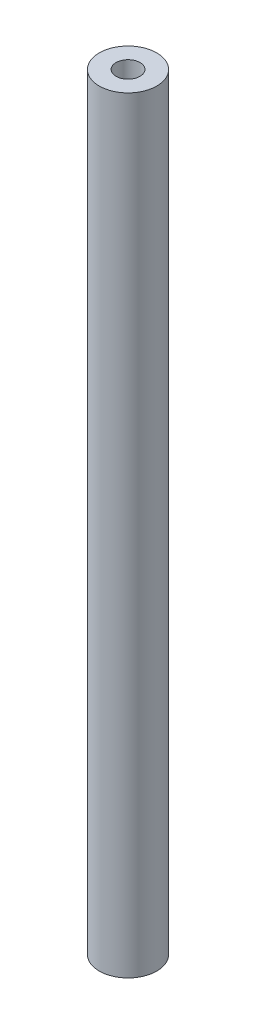
ISO-10303-21;
HEADER;
FILE_DESCRIPTION(('STEP AP214'),'2;1');
FILE_NAME('part.step','',(''),(''),'','','');
FILE_SCHEMA(('AUTOMOTIVE_DESIGN { 1 0 10303 214 1 1 1 1 }'));
ENDSEC;
DATA;
#1=APPLICATION_CONTEXT('core data for automotive mechanical design processes');
#2=APPLICATION_PROTOCOL_DEFINITION('international standard','automotive_design',2000,#1);
#3=PRODUCT_CONTEXT('',#1,'mechanical');
#4=PRODUCT('Part','Part','',(#3));
#5=PRODUCT_RELATED_PRODUCT_CATEGORY('part','',(#4));
#6=PRODUCT_DEFINITION_FORMATION('','',#4);
#7=PRODUCT_DEFINITION_CONTEXT('part definition',#1,'design');
#8=PRODUCT_DEFINITION('design','',#6,#7);
#9=PRODUCT_DEFINITION_SHAPE('','',#8);
#10=(LENGTH_UNIT() NAMED_UNIT(*) SI_UNIT(.MILLI.,.METRE.));
#11=(NAMED_UNIT(*) PLANE_ANGLE_UNIT() SI_UNIT($,.RADIAN.));
#12=(NAMED_UNIT(*) SI_UNIT($,.STERADIAN.) SOLID_ANGLE_UNIT());
#13=UNCERTAINTY_MEASURE_WITH_UNIT(LENGTH_MEASURE(1.E-05),#10,'distance_accuracy_value','');
#14=(GEOMETRIC_REPRESENTATION_CONTEXT(3) GLOBAL_UNCERTAINTY_ASSIGNED_CONTEXT((#13)) GLOBAL_UNIT_ASSIGNED_CONTEXT((#10,
#11,#12)) REPRESENTATION_CONTEXT('',''));
#15=CARTESIAN_POINT('',(0.,0.,0.));
#16=DIRECTION('',(0.,0.,1.));
#17=DIRECTION('',(1.,0.,0.));
#18=AXIS2_PLACEMENT_3D('',#15,#16,#17);
#19=CARTESIAN_POINT('',(0.,1219.2,0.));
#20=DIRECTION('',(0.,-1.,0.));
#21=DIRECTION('',(0.,0.,-1.));
#22=AXIS2_PLACEMENT_3D('',#19,#20,#21);
#23=CYLINDRICAL_SURFACE('',#22,45.72);
#24=CARTESIAN_POINT('',(0.,1219.2,0.));
#25=DIRECTION('',(0.,1.,0.));
#26=DIRECTION('',(0.,0.,1.));
#27=AXIS2_PLACEMENT_3D('',#24,#25,#26);
#28=CIRCLE('',#27,45.72);
#29=CARTESIAN_POINT('',(0.,1219.2,-45.72));
#30=VERTEX_POINT('',#29);
#31=EDGE_CURVE('E10',#30,#30,#28,.T.);
#32=CARTESIAN_POINT('',(0.,0.,0.));
#33=DIRECTION('',(0.,1.,0.));
#34=DIRECTION('',(0.,0.,1.));
#35=AXIS2_PLACEMENT_3D('',#32,#33,#34);
#36=CIRCLE('',#35,45.72);
#37=CARTESIAN_POINT('',(0.,0.,-45.72));
#38=VERTEX_POINT('',#37);
#39=EDGE_CURVE('E38',#38,#38,#36,.T.);
#40=CARTESIAN_POINT('',(0.,1219.2,-45.72));
#41=CARTESIAN_POINT('',(0.,1206.5,-45.72));
#42=CARTESIAN_POINT('',(0.,1193.8,-45.72));
#43=CARTESIAN_POINT('',(0.,1168.4,-45.72));
#44=CARTESIAN_POINT('',(0.,1155.7,-45.72));
#45=CARTESIAN_POINT('',(0.,1130.3,-45.72));
#46=CARTESIAN_POINT('',(0.,1117.6,-45.72));
#47=CARTESIAN_POINT('',(0.,1092.2,-45.72));
#48=CARTESIAN_POINT('',(0.,1079.5,-45.72));
#49=CARTESIAN_POINT('',(0.,1054.1,-45.72));
#50=CARTESIAN_POINT('',(0.,1041.4,-45.72));
#51=CARTESIAN_POINT('',(0.,1016.,-45.72));
#52=CARTESIAN_POINT('',(0.,1003.3,-45.72));
#53=CARTESIAN_POINT('',(0.,977.9,-45.72));
#54=CARTESIAN_POINT('',(0.,965.2,-45.72));
#55=CARTESIAN_POINT('',(0.,939.8,-45.72));
#56=CARTESIAN_POINT('',(0.,927.1,-45.72));
#57=CARTESIAN_POINT('',(0.,901.7,-45.72));
#58=CARTESIAN_POINT('',(0.,889.,-45.72));
#59=CARTESIAN_POINT('',(0.,863.6,-45.72));
#60=CARTESIAN_POINT('',(0.,850.9,-45.72));
#61=CARTESIAN_POINT('',(0.,825.5,-45.72));
#62=CARTESIAN_POINT('',(0.,812.8,-45.72));
#63=CARTESIAN_POINT('',(0.,787.4,-45.72));
#64=CARTESIAN_POINT('',(0.,774.7,-45.72));
#65=CARTESIAN_POINT('',(0.,749.3,-45.72));
#66=CARTESIAN_POINT('',(0.,736.6,-45.72));
#67=CARTESIAN_POINT('',(0.,711.2,-45.72));
#68=CARTESIAN_POINT('',(0.,698.5,-45.72));
#69=CARTESIAN_POINT('',(0.,673.1,-45.72));
#70=CARTESIAN_POINT('',(0.,660.4,-45.72));
#71=CARTESIAN_POINT('',(0.,635.,-45.72));
#72=CARTESIAN_POINT('',(0.,622.3,-45.72));
#73=CARTESIAN_POINT('',(0.,596.9,-45.72));
#74=CARTESIAN_POINT('',(0.,584.2,-45.72));
#75=CARTESIAN_POINT('',(0.,558.8,-45.72));
#76=CARTESIAN_POINT('',(0.,546.1,-45.72));
#77=CARTESIAN_POINT('',(0.,520.7,-45.72));
#78=CARTESIAN_POINT('',(0.,508.,-45.72));
#79=CARTESIAN_POINT('',(0.,482.6,-45.72));
#80=CARTESIAN_POINT('',(0.,469.9,-45.72));
#81=CARTESIAN_POINT('',(0.,444.5,-45.72));
#82=CARTESIAN_POINT('',(0.,431.8,-45.72));
#83=CARTESIAN_POINT('',(0.,406.4,-45.72));
#84=CARTESIAN_POINT('',(0.,393.7,-45.72));
#85=CARTESIAN_POINT('',(0.,368.3,-45.72));
#86=CARTESIAN_POINT('',(0.,355.6,-45.72));
#87=CARTESIAN_POINT('',(0.,330.2,-45.72));
#88=CARTESIAN_POINT('',(0.,317.5,-45.72));
#89=CARTESIAN_POINT('',(0.,292.1,-45.72));
#90=CARTESIAN_POINT('',(0.,279.4,-45.72));
#91=CARTESIAN_POINT('',(0.,254.,-45.72));
#92=CARTESIAN_POINT('',(0.,241.3,-45.72));
#93=CARTESIAN_POINT('',(0.,215.9,-45.72));
#94=CARTESIAN_POINT('',(0.,203.2,-45.72));
#95=CARTESIAN_POINT('',(0.,177.8,-45.72));
#96=CARTESIAN_POINT('',(0.,165.1,-45.72));
#97=CARTESIAN_POINT('',(0.,139.7,-45.72));
#98=CARTESIAN_POINT('',(0.,127.,-45.72));
#99=CARTESIAN_POINT('',(0.,101.6,-45.72));
#100=CARTESIAN_POINT('',(0.,88.9,-45.72));
#101=CARTESIAN_POINT('',(0.,63.5,-45.72));
#102=CARTESIAN_POINT('',(0.,50.8,-45.72));
#103=CARTESIAN_POINT('',(0.,25.4,-45.72));
#104=CARTESIAN_POINT('',(0.,12.7,-45.72));
#105=CARTESIAN_POINT('',(0.,0.,-45.72));
#106=B_SPLINE_CURVE_WITH_KNOTS('',3,(#40,#41,#42,#43,#44,#45,#46,#47,#48,#49,#50,#51,#52,#53,
#54,#55,#56,#57,#58,#59,#60,#61,#62,#63,#64,#65,#66,#67,#68,#69,#70,#71,#72,#73,#74,#75,#76,#77,
#78,#79,#80,#81,#82,#83,#84,#85,#86,#87,#88,#89,#90,#91,#92,#93,#94,#95,#96,#97,#98,#99,#100,
#101,#102,#103,#104,#105),.UNSPECIFIED.,.F.,.F.,(4,2,2,2,2,2,2,2,2,2,2,2,2,2,2,2,2,2,2,2,2,2,2,
2,2,2,2,2,2,2,2,2,4),(0.,38.1,76.2,114.3,152.4,190.5,228.6,266.7,304.8,342.9,381.,419.1,457.2,
495.3,533.4,571.5,609.6,647.7,685.8,723.9,762.,800.1,838.2,876.3,914.4,952.5,990.6,1028.7,
1066.8,1104.9,1143.,1181.1,1219.2),.UNSPECIFIED.);
#107=EDGE_CURVE('BSEAM35',#30,#38,#106,.T.);
#108=ORIENTED_EDGE('',*,*,#31,.F.);
#109=ORIENTED_EDGE('',*,*,#39,.T.);
#110=ORIENTED_EDGE('',*,*,#107,.T.);
#111=ORIENTED_EDGE('',*,*,#107,.F.);
#112=EDGE_LOOP('',(#108,#110,#109,#111));
#113=FACE_BOUND('',#112,.T.);
#114=ADVANCED_FACE('F35',(#113),#23,.T.);
#115=CARTESIAN_POINT('',(0.,1219.2,0.));
#116=DIRECTION('',(0.,1.,0.));
#117=DIRECTION('',(0.,0.,1.));
#118=AXIS2_PLACEMENT_3D('',#115,#116,#117);
#119=PLANE('',#118);
#120=CARTESIAN_POINT('',(0.,1219.2,0.));
#121=DIRECTION('',(0.,1.,0.));
#122=DIRECTION('',(0.,0.,1.));
#123=AXIS2_PLACEMENT_3D('',#120,#121,#122);
#124=CIRCLE('',#123,19.05);
#125=CARTESIAN_POINT('',(0.,1219.2,19.05));
#126=VERTEX_POINT('',#125);
#127=EDGE_CURVE('E48',#126,#126,#124,.T.);
#128=ORIENTED_EDGE('',*,*,#127,.F.);
#129=EDGE_LOOP('',(#128));
#130=FACE_BOUND('',#129,.T.);
#131=ORIENTED_EDGE('',*,*,#31,.T.);
#132=EDGE_LOOP('',(#131));
#133=FACE_BOUND('',#132,.T.);
#134=ADVANCED_FACE('F64',(#130,#133),#119,.T.);
#135=CARTESIAN_POINT('',(0.,0.,0.));
#136=DIRECTION('',(0.,1.,0.));
#137=DIRECTION('',(0.,0.,1.));
#138=AXIS2_PLACEMENT_3D('',#135,#136,#137);
#139=PLANE('',#138);
#140=CARTESIAN_POINT('',(0.,0.,0.));
#141=DIRECTION('',(0.,1.,0.));
#142=DIRECTION('',(0.,0.,1.));
#143=AXIS2_PLACEMENT_3D('',#140,#141,#142);
#144=CIRCLE('',#143,19.05);
#145=CARTESIAN_POINT('',(0.,0.,19.05));
#146=VERTEX_POINT('',#145);
#147=EDGE_CURVE('E46',#146,#146,#144,.T.);
#148=ORIENTED_EDGE('',*,*,#147,.T.);
#149=EDGE_LOOP('',(#148));
#150=FACE_BOUND('',#149,.T.);
#151=ORIENTED_EDGE('',*,*,#39,.F.);
#152=EDGE_LOOP('',(#151));
#153=FACE_BOUND('',#152,.T.);
#154=ADVANCED_FACE('F55',(#150,#153),#139,.F.);
#155=CARTESIAN_POINT('',(0.,0.,0.));
#156=DIRECTION('',(0.,1.,0.));
#157=DIRECTION('',(0.,0.,1.));
#158=AXIS2_PLACEMENT_3D('',#155,#156,#157);
#159=CYLINDRICAL_SURFACE('',#158,19.05);
#160=CARTESIAN_POINT('',(0.,0.,19.05));
#161=CARTESIAN_POINT('',(0.,12.7,19.05));
#162=CARTESIAN_POINT('',(0.,25.4,19.05));
#163=CARTESIAN_POINT('',(0.,50.8,19.05));
#164=CARTESIAN_POINT('',(0.,63.5,19.05));
#165=CARTESIAN_POINT('',(0.,88.9,19.05));
#166=CARTESIAN_POINT('',(0.,101.6,19.05));
#167=CARTESIAN_POINT('',(0.,127.,19.05));
#168=CARTESIAN_POINT('',(0.,139.7,19.05));
#169=CARTESIAN_POINT('',(0.,165.1,19.05));
#170=CARTESIAN_POINT('',(0.,177.8,19.05));
#171=CARTESIAN_POINT('',(0.,203.2,19.05));
#172=CARTESIAN_POINT('',(0.,215.9,19.05));
#173=CARTESIAN_POINT('',(0.,241.3,19.05));
#174=CARTESIAN_POINT('',(0.,254.,19.05));
#175=CARTESIAN_POINT('',(0.,279.4,19.05));
#176=CARTESIAN_POINT('',(0.,292.1,19.05));
#177=CARTESIAN_POINT('',(0.,317.5,19.05));
#178=CARTESIAN_POINT('',(0.,330.2,19.05));
#179=CARTESIAN_POINT('',(0.,355.6,19.05));
#180=CARTESIAN_POINT('',(0.,368.3,19.05));
#181=CARTESIAN_POINT('',(0.,393.7,19.05));
#182=CARTESIAN_POINT('',(0.,406.4,19.05));
#183=CARTESIAN_POINT('',(0.,431.8,19.05));
#184=CARTESIAN_POINT('',(0.,444.5,19.05));
#185=CARTESIAN_POINT('',(0.,469.9,19.05));
#186=CARTESIAN_POINT('',(0.,482.6,19.05));
#187=CARTESIAN_POINT('',(0.,508.,19.05));
#188=CARTESIAN_POINT('',(0.,520.7,19.05));
#189=CARTESIAN_POINT('',(0.,546.1,19.05));
#190=CARTESIAN_POINT('',(0.,558.8,19.05));
#191=CARTESIAN_POINT('',(0.,584.2,19.05));
#192=CARTESIAN_POINT('',(0.,596.9,19.05));
#193=CARTESIAN_POINT('',(0.,622.3,19.05));
#194=CARTESIAN_POINT('',(0.,635.,19.05));
#195=CARTESIAN_POINT('',(0.,660.4,19.05));
#196=CARTESIAN_POINT('',(0.,673.1,19.05));
#197=CARTESIAN_POINT('',(0.,698.5,19.05));
#198=CARTESIAN_POINT('',(0.,711.2,19.05));
#199=CARTESIAN_POINT('',(0.,736.6,19.05));
#200=CARTESIAN_POINT('',(0.,749.3,19.05));
#201=CARTESIAN_POINT('',(0.,774.7,19.05));
#202=CARTESIAN_POINT('',(0.,787.4,19.05));
#203=CARTESIAN_POINT('',(0.,812.8,19.05));
#204=CARTESIAN_POINT('',(0.,825.5,19.05));
#205=CARTESIAN_POINT('',(0.,850.9,19.05));
#206=CARTESIAN_POINT('',(0.,863.6,19.05));
#207=CARTESIAN_POINT('',(0.,889.,19.05));
#208=CARTESIAN_POINT('',(0.,901.7,19.05));
#209=CARTESIAN_POINT('',(0.,927.1,19.05));
#210=CARTESIAN_POINT('',(0.,939.8,19.05));
#211=CARTESIAN_POINT('',(0.,965.2,19.05));
#212=CARTESIAN_POINT('',(0.,977.9,19.05));
#213=CARTESIAN_POINT('',(0.,1003.3,19.05));
#214=CARTESIAN_POINT('',(0.,1016.,19.05));
#215=CARTESIAN_POINT('',(0.,1041.4,19.05));
#216=CARTESIAN_POINT('',(0.,1054.1,19.05));
#217=CARTESIAN_POINT('',(0.,1079.5,19.05));
#218=CARTESIAN_POINT('',(0.,1092.2,19.05));
#219=CARTESIAN_POINT('',(0.,1117.6,19.05));
#220=CARTESIAN_POINT('',(0.,1130.3,19.05));
#221=CARTESIAN_POINT('',(0.,1155.7,19.05));
#222=CARTESIAN_POINT('',(0.,1168.4,19.05));
#223=CARTESIAN_POINT('',(0.,1193.8,19.05));
#224=CARTESIAN_POINT('',(0.,1206.5,19.05));
#225=CARTESIAN_POINT('',(0.,1219.2,19.05));
#226=B_SPLINE_CURVE_WITH_KNOTS('',3,(#160,#161,#162,#163,#164,#165,#166,#167,#168,#169,#170,
#171,#172,#173,#174,#175,#176,#177,#178,#179,#180,#181,#182,#183,#184,#185,#186,#187,#188,#189,
#190,#191,#192,#193,#194,#195,#196,#197,#198,#199,#200,#201,#202,#203,#204,#205,#206,#207,#208,
#209,#210,#211,#212,#213,#214,#215,#216,#217,#218,#219,#220,#221,#222,#223,#224,#225),
.UNSPECIFIED.,.F.,.F.,(4,2,2,2,2,2,2,2,2,2,2,2,2,2,2,2,2,2,2,2,2,2,2,2,2,2,2,2,2,2,2,2,4),(0.,
38.1,76.2,114.3,152.4,190.5,228.6,266.7,304.8,342.9,381.,419.1,457.2,495.3,533.4,571.5,609.6,
647.7,685.8,723.9,762.,800.1,838.2,876.3,914.4,952.5,990.6,1028.7,1066.8,1104.9,1143.,1181.1,
1219.2),.UNSPECIFIED.);
#227=EDGE_CURVE('BSEAM58',#146,#126,#226,.T.);
#228=ORIENTED_EDGE('',*,*,#147,.F.);
#229=ORIENTED_EDGE('',*,*,#127,.T.);
#230=ORIENTED_EDGE('',*,*,#227,.T.);
#231=ORIENTED_EDGE('',*,*,#227,.F.);
#232=EDGE_LOOP('',(#228,#230,#229,#231));
#233=FACE_BOUND('',#232,.T.);
#234=ADVANCED_FACE('F58',(#233),#159,.F.);
#235=CLOSED_SHELL('',(#114,#134,#154,#234));
#236=MANIFOLD_SOLID_BREP('B2',#235);
#237=ADVANCED_BREP_SHAPE_REPRESENTATION('',(#18,#236),#14);
#238=SHAPE_DEFINITION_REPRESENTATION(#9,#237);
ENDSEC;
END-ISO-10303-21;
